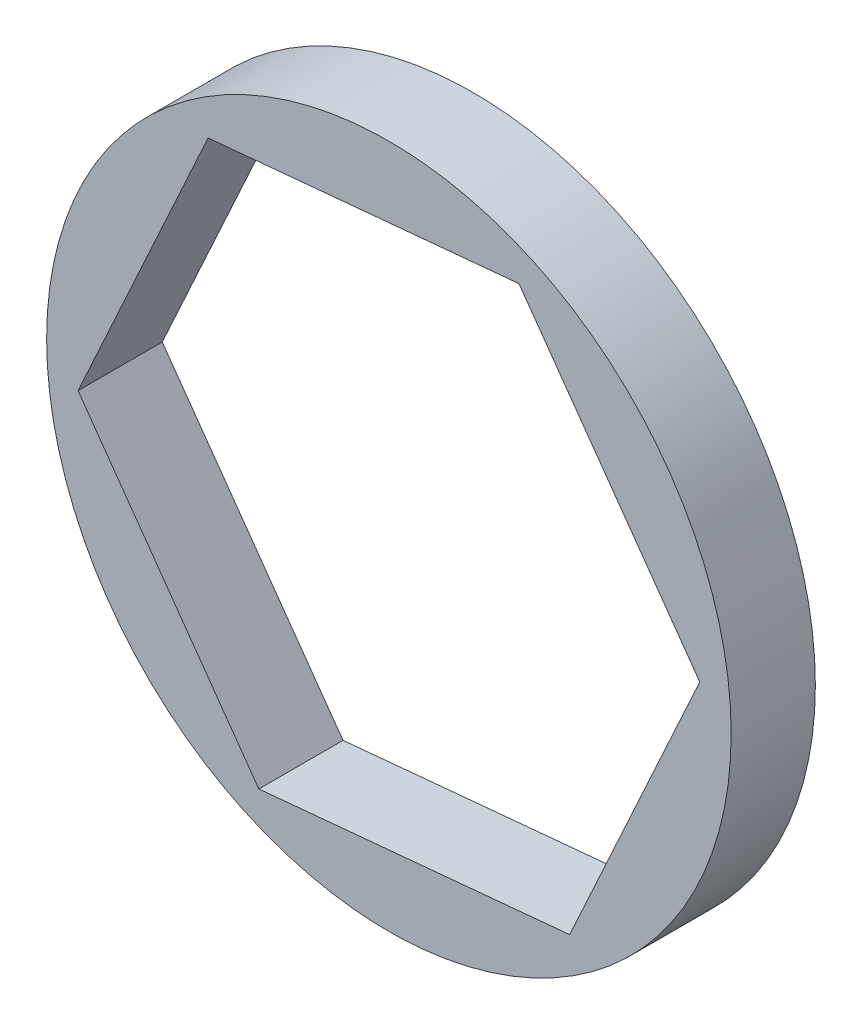
ISO-10303-21;
HEADER;
FILE_DESCRIPTION(('STEP AP214'),'2;1');
FILE_NAME('part.step','',(''),(''),'','','');
FILE_SCHEMA(('AUTOMOTIVE_DESIGN { 1 0 10303 214 1 1 1 1 }'));
ENDSEC;
DATA;
#1=APPLICATION_CONTEXT('core data for automotive mechanical design processes');
#2=APPLICATION_PROTOCOL_DEFINITION('international standard','automotive_design',2000,#1);
#3=PRODUCT_CONTEXT('',#1,'mechanical');
#4=PRODUCT('Part','Part','',(#3));
#5=PRODUCT_RELATED_PRODUCT_CATEGORY('part','',(#4));
#6=PRODUCT_DEFINITION_FORMATION('','',#4);
#7=PRODUCT_DEFINITION_CONTEXT('part definition',#1,'design');
#8=PRODUCT_DEFINITION('design','',#6,#7);
#9=PRODUCT_DEFINITION_SHAPE('','',#8);
#10=(LENGTH_UNIT() NAMED_UNIT(*) SI_UNIT(.MILLI.,.METRE.));
#11=(NAMED_UNIT(*) PLANE_ANGLE_UNIT() SI_UNIT($,.RADIAN.));
#12=(NAMED_UNIT(*) SI_UNIT($,.STERADIAN.) SOLID_ANGLE_UNIT());
#13=UNCERTAINTY_MEASURE_WITH_UNIT(LENGTH_MEASURE(1.E-05),#10,'distance_accuracy_value','');
#14=(GEOMETRIC_REPRESENTATION_CONTEXT(3) GLOBAL_UNCERTAINTY_ASSIGNED_CONTEXT((#13)) GLOBAL_UNIT_ASSIGNED_CONTEXT((#10,
#11,#12)) REPRESENTATION_CONTEXT('',''));
#15=CARTESIAN_POINT('',(0.,0.,0.));
#16=DIRECTION('',(0.,0.,1.));
#17=DIRECTION('',(1.,0.,0.));
#18=AXIS2_PLACEMENT_3D('',#15,#16,#17);
#19=CARTESIAN_POINT('',(0.,0.,1.5621));
#20=DIRECTION('',(0.,0.,1.));
#21=DIRECTION('',(1.,0.,0.));
#22=AXIS2_PLACEMENT_3D('',#19,#20,#21);
#23=PLANE('',#22);
#24=CARTESIAN_POINT('',(0.,0.,1.5621));
#25=DIRECTION('',(0.,0.,1.));
#26=DIRECTION('',(1.,0.,0.));
#27=AXIS2_PLACEMENT_3D('',#24,#25,#26);
#28=CIRCLE('',#27,6.35);
#29=CARTESIAN_POINT('',(6.35,0.,1.5621));
#30=VERTEX_POINT('',#29);
#31=EDGE_CURVE('E11',#30,#30,#28,.T.);
#32=ORIENTED_EDGE('',*,*,#31,.T.);
#33=EDGE_LOOP('',(#32));
#34=FACE_BOUND('',#33,.T.);
#35=DIRECTION('',(-0.416593831263027,-0.90909272340812,0.));
#36=VECTOR('',#35,1.);
#37=CARTESIAN_POINT('',(-3.35389225461433,4.72282786874255,1.5621));
#38=LINE('',#37,#36);
#39=CARTESIAN_POINT('',(-3.35389225461433,4.72282786874255,1.5621));
#40=VERTEX_POINT('',#39);
#41=CARTESIAN_POINT('',(-5.76703503933933,-0.543141959680603,1.5621));
#42=VERTEX_POINT('',#41);
#43=EDGE_CURVE('E96',#40,#42,#38,.T.);
#44=ORIENTED_EDGE('',*,*,#43,.F.);
#45=DIRECTION('',(-0.995594308498526,-0.0937655207703908,0.));
#46=VECTOR('',#45,1.);
#47=CARTESIAN_POINT('',(2.413142784725,5.26596982842316,1.5621));
#48=LINE('',#47,#46);
#49=CARTESIAN_POINT('',(2.413142784725,5.26596982842316,1.5621));
#50=VERTEX_POINT('',#49);
#51=EDGE_CURVE('E88',#50,#40,#48,.T.);
#52=ORIENTED_EDGE('',*,*,#51,.F.);
#53=DIRECTION('',(-0.579000477235498,0.81532720263773,0.));
#54=VECTOR('',#53,1.);
#55=CARTESIAN_POINT('',(5.76703503933933,0.543141959680604,1.5621));
#56=LINE('',#55,#54);
#57=CARTESIAN_POINT('',(5.76703503933933,0.543141959680604,1.5621));
#58=VERTEX_POINT('',#57);
#59=EDGE_CURVE('E116',#58,#50,#56,.T.);
#60=ORIENTED_EDGE('',*,*,#59,.F.);
#61=DIRECTION('',(0.416593831263027,0.90909272340812,0.));
#62=VECTOR('',#61,1.);
#63=CARTESIAN_POINT('',(3.35389225461433,-4.72282786874255,1.5621));
#64=LINE('',#63,#62);
#65=CARTESIAN_POINT('',(3.35389225461433,-4.72282786874255,1.5621));
#66=VERTEX_POINT('',#65);
#67=EDGE_CURVE('E114',#66,#58,#64,.T.);
#68=ORIENTED_EDGE('',*,*,#67,.F.);
#69=DIRECTION('',(0.995594308498526,0.0937655207703912,0.));
#70=VECTOR('',#69,1.);
#71=CARTESIAN_POINT('',(-2.413142784725,-5.26596982842316,1.5621));
#72=LINE('',#71,#70);
#73=CARTESIAN_POINT('',(-2.413142784725,-5.26596982842316,1.5621));
#74=VERTEX_POINT('',#73);
#75=EDGE_CURVE('E110',#74,#66,#72,.T.);
#76=ORIENTED_EDGE('',*,*,#75,.F.);
#77=DIRECTION('',(0.579000477235498,-0.815327202637729,0.));
#78=VECTOR('',#77,1.);
#79=CARTESIAN_POINT('',(-5.76703503933933,-0.543141959680603,1.5621));
#80=LINE('',#79,#78);
#81=EDGE_CURVE('E108',#42,#74,#80,.T.);
#82=ORIENTED_EDGE('',*,*,#81,.F.);
#83=EDGE_LOOP('',(#44,#52,#60,#68,#76,#82));
#84=FACE_BOUND('',#83,.T.);
#85=ADVANCED_FACE('F35',(#34,#84),#23,.T.);
#86=CARTESIAN_POINT('',(0.,0.,0.));
#87=DIRECTION('',(0.,0.,1.));
#88=DIRECTION('',(1.,0.,0.));
#89=AXIS2_PLACEMENT_3D('',#86,#87,#88);
#90=PLANE('',#89);
#91=CARTESIAN_POINT('',(0.,0.,0.));
#92=DIRECTION('',(0.,0.,1.));
#93=DIRECTION('',(1.,0.,0.));
#94=AXIS2_PLACEMENT_3D('',#91,#92,#93);
#95=CIRCLE('',#94,6.35);
#96=CARTESIAN_POINT('',(6.35,0.,0.));
#97=VERTEX_POINT('',#96);
#98=EDGE_CURVE('E39',#97,#97,#95,.T.);
#99=ORIENTED_EDGE('',*,*,#98,.F.);
#100=EDGE_LOOP('',(#99));
#101=FACE_BOUND('',#100,.T.);
#102=DIRECTION('',(-0.995594308498526,-0.0937655207703908,0.));
#103=VECTOR('',#102,1.);
#104=CARTESIAN_POINT('',(2.413142784725,5.26596982842316,0.));
#105=LINE('',#104,#103);
#106=CARTESIAN_POINT('',(2.413142784725,5.26596982842316,0.));
#107=VERTEX_POINT('',#106);
#108=CARTESIAN_POINT('',(-3.35389225461433,4.72282786874255,0.));
#109=VERTEX_POINT('',#108);
#110=EDGE_CURVE('E58',#107,#109,#105,.T.);
#111=ORIENTED_EDGE('',*,*,#110,.T.);
#112=DIRECTION('',(-0.416593831263027,-0.90909272340812,0.));
#113=VECTOR('',#112,1.);
#114=CARTESIAN_POINT('',(-3.35389225461433,4.72282786874255,0.));
#115=LINE('',#114,#113);
#116=CARTESIAN_POINT('',(-5.76703503933933,-0.543141959680603,0.));
#117=VERTEX_POINT('',#116);
#118=EDGE_CURVE('E103',#109,#117,#115,.T.);
#119=ORIENTED_EDGE('',*,*,#118,.T.);
#120=DIRECTION('',(0.579000477235498,-0.815327202637729,0.));
#121=VECTOR('',#120,1.);
#122=CARTESIAN_POINT('',(-5.76703503933933,-0.543141959680603,0.));
#123=LINE('',#122,#121);
#124=CARTESIAN_POINT('',(-2.413142784725,-5.26596982842316,0.));
#125=VERTEX_POINT('',#124);
#126=EDGE_CURVE('E120',#117,#125,#123,.T.);
#127=ORIENTED_EDGE('',*,*,#126,.T.);
#128=DIRECTION('',(0.995594308498526,0.0937655207703912,0.));
#129=VECTOR('',#128,1.);
#130=CARTESIAN_POINT('',(-2.413142784725,-5.26596982842316,0.));
#131=LINE('',#130,#129);
#132=CARTESIAN_POINT('',(3.35389225461433,-4.72282786874255,0.));
#133=VERTEX_POINT('',#132);
#134=EDGE_CURVE('E123',#125,#133,#131,.T.);
#135=ORIENTED_EDGE('',*,*,#134,.T.);
#136=DIRECTION('',(0.416593831263027,0.90909272340812,0.));
#137=VECTOR('',#136,1.);
#138=CARTESIAN_POINT('',(3.35389225461433,-4.72282786874255,0.));
#139=LINE('',#138,#137);
#140=CARTESIAN_POINT('',(5.76703503933933,0.543141959680604,0.));
#141=VERTEX_POINT('',#140);
#142=EDGE_CURVE('E126',#133,#141,#139,.T.);
#143=ORIENTED_EDGE('',*,*,#142,.T.);
#144=DIRECTION('',(-0.579000477235498,0.81532720263773,0.));
#145=VECTOR('',#144,1.);
#146=CARTESIAN_POINT('',(5.76703503933933,0.543141959680604,0.));
#147=LINE('',#146,#145);
#148=EDGE_CURVE('E97',#141,#107,#147,.T.);
#149=ORIENTED_EDGE('',*,*,#148,.T.);
#150=EDGE_LOOP('',(#111,#119,#127,#135,#143,#149));
#151=FACE_BOUND('',#150,.T.);
#152=ADVANCED_FACE('F143',(#101,#151),#90,.F.);
#153=CARTESIAN_POINT('',(0.,0.,1.5621));
#154=DIRECTION('',(0.,0.,-1.));
#155=DIRECTION('',(-1.,0.,0.));
#156=AXIS2_PLACEMENT_3D('',#153,#154,#155);
#157=CYLINDRICAL_SURFACE('',#156,6.35);
#158=ORIENTED_EDGE('',*,*,#31,.F.);
#159=EDGE_LOOP('',(#158));
#160=FACE_BOUND('',#159,.T.);
#161=ORIENTED_EDGE('',*,*,#98,.T.);
#162=EDGE_LOOP('',(#161));
#163=FACE_BOUND('',#162,.T.);
#164=ADVANCED_FACE('F37',(#160,#163),#157,.T.);
#165=CARTESIAN_POINT('',(2.413142784725,5.26596982842316,1.5621));
#166=DIRECTION('',(0.0937655207703908,-0.995594308498526,0.));
#167=DIRECTION('',(0.995594308498526,0.0937655207703908,0.));
#168=AXIS2_PLACEMENT_3D('',#165,#166,#167);
#169=PLANE('',#168);
#170=ORIENTED_EDGE('',*,*,#110,.F.);
#171=DIRECTION('',(0.,0.,-1.));
#172=VECTOR('',#171,1.);
#173=CARTESIAN_POINT('',(2.413142784725,5.26596982842316,1.5621));
#174=LINE('',#173,#172);
#175=EDGE_CURVE('E92',#50,#107,#174,.T.);
#176=ORIENTED_EDGE('',*,*,#175,.F.);
#177=ORIENTED_EDGE('',*,*,#51,.T.);
#178=DIRECTION('',(0.,0.,-1.));
#179=VECTOR('',#178,1.);
#180=CARTESIAN_POINT('',(-3.35389225461433,4.72282786874255,1.5621));
#181=LINE('',#180,#179);
#182=EDGE_CURVE('E91',#40,#109,#181,.T.);
#183=ORIENTED_EDGE('',*,*,#182,.T.);
#184=EDGE_LOOP('',(#170,#176,#177,#183));
#185=FACE_BOUND('',#184,.T.);
#186=ADVANCED_FACE('F90',(#185),#169,.T.);
#187=CARTESIAN_POINT('',(-3.35389225461433,4.72282786874255,1.5621));
#188=DIRECTION('',(0.90909272340812,-0.416593831263027,0.));
#189=DIRECTION('',(0.416593831263027,0.90909272340812,0.));
#190=AXIS2_PLACEMENT_3D('',#187,#188,#189);
#191=PLANE('',#190);
#192=ORIENTED_EDGE('',*,*,#118,.F.);
#193=ORIENTED_EDGE('',*,*,#182,.F.);
#194=ORIENTED_EDGE('',*,*,#43,.T.);
#195=DIRECTION('',(0.,0.,-1.));
#196=VECTOR('',#195,1.);
#197=CARTESIAN_POINT('',(-5.76703503933933,-0.543141959680603,1.5621));
#198=LINE('',#197,#196);
#199=EDGE_CURVE('E104',#42,#117,#198,.T.);
#200=ORIENTED_EDGE('',*,*,#199,.T.);
#201=EDGE_LOOP('',(#192,#193,#194,#200));
#202=FACE_BOUND('',#201,.T.);
#203=ADVANCED_FACE('F100',(#202),#191,.T.);
#204=CARTESIAN_POINT('',(-5.76703503933933,-0.543141959680603,1.5621));
#205=DIRECTION('',(0.81532720263773,0.579000477235498,0.));
#206=DIRECTION('',(-0.579000477235498,0.81532720263773,0.));
#207=AXIS2_PLACEMENT_3D('',#204,#205,#206);
#208=PLANE('',#207);
#209=ORIENTED_EDGE('',*,*,#126,.F.);
#210=ORIENTED_EDGE('',*,*,#199,.F.);
#211=ORIENTED_EDGE('',*,*,#81,.T.);
#212=DIRECTION('',(0.,0.,-1.));
#213=VECTOR('',#212,1.);
#214=CARTESIAN_POINT('',(-2.413142784725,-5.26596982842316,1.5621));
#215=LINE('',#214,#213);
#216=EDGE_CURVE('E135',#74,#125,#215,.T.);
#217=ORIENTED_EDGE('',*,*,#216,.T.);
#218=EDGE_LOOP('',(#209,#210,#211,#217));
#219=FACE_BOUND('',#218,.T.);
#220=ADVANCED_FACE('F139',(#219),#208,.T.);
#221=CARTESIAN_POINT('',(-2.413142784725,-5.26596982842316,1.5621));
#222=DIRECTION('',(-0.0937655207703912,0.995594308498525,0.));
#223=DIRECTION('',(-0.995594308498526,-0.0937655207703912,0.));
#224=AXIS2_PLACEMENT_3D('',#221,#222,#223);
#225=PLANE('',#224);
#226=ORIENTED_EDGE('',*,*,#134,.F.);
#227=ORIENTED_EDGE('',*,*,#216,.F.);
#228=ORIENTED_EDGE('',*,*,#75,.T.);
#229=DIRECTION('',(0.,0.,-1.));
#230=VECTOR('',#229,1.);
#231=CARTESIAN_POINT('',(3.35389225461433,-4.72282786874255,1.5621));
#232=LINE('',#231,#230);
#233=EDGE_CURVE('E133',#66,#133,#232,.T.);
#234=ORIENTED_EDGE('',*,*,#233,.T.);
#235=EDGE_LOOP('',(#226,#227,#228,#234));
#236=FACE_BOUND('',#235,.T.);
#237=ADVANCED_FACE('F151',(#236),#225,.T.);
#238=CARTESIAN_POINT('',(3.35389225461433,-4.72282786874255,1.5621));
#239=DIRECTION('',(-0.90909272340812,0.416593831263027,0.));
#240=DIRECTION('',(-0.416593831263027,-0.90909272340812,0.));
#241=AXIS2_PLACEMENT_3D('',#238,#239,#240);
#242=PLANE('',#241);
#243=ORIENTED_EDGE('',*,*,#142,.F.);
#244=ORIENTED_EDGE('',*,*,#233,.F.);
#245=ORIENTED_EDGE('',*,*,#67,.T.);
#246=DIRECTION('',(0.,0.,-1.));
#247=VECTOR('',#246,1.);
#248=CARTESIAN_POINT('',(5.76703503933933,0.543141959680604,1.5621));
#249=LINE('',#248,#247);
#250=EDGE_CURVE('E50',#58,#141,#249,.T.);
#251=ORIENTED_EDGE('',*,*,#250,.T.);
#252=EDGE_LOOP('',(#243,#244,#245,#251));
#253=FACE_BOUND('',#252,.T.);
#254=ADVANCED_FACE('F149',(#253),#242,.T.);
#255=CARTESIAN_POINT('',(5.76703503933933,0.543141959680604,1.5621));
#256=DIRECTION('',(-0.81532720263773,-0.579000477235498,0.));
#257=DIRECTION('',(0.579000477235498,-0.81532720263773,0.));
#258=AXIS2_PLACEMENT_3D('',#255,#256,#257);
#259=PLANE('',#258);
#260=ORIENTED_EDGE('',*,*,#148,.F.);
#261=ORIENTED_EDGE('',*,*,#250,.F.);
#262=ORIENTED_EDGE('',*,*,#59,.T.);
#263=ORIENTED_EDGE('',*,*,#175,.T.);
#264=EDGE_LOOP('',(#260,#261,#262,#263));
#265=FACE_BOUND('',#264,.T.);
#266=ADVANCED_FACE('F145',(#265),#259,.T.);
#267=CLOSED_SHELL('',(#85,#152,#164,#186,#203,#220,#237,#254,#266));
#268=MANIFOLD_SOLID_BREP('B2',#267);
#269=ADVANCED_BREP_SHAPE_REPRESENTATION('',(#18,#268),#14);
#270=SHAPE_DEFINITION_REPRESENTATION(#9,#269);
ENDSEC;
END-ISO-10303-21;
